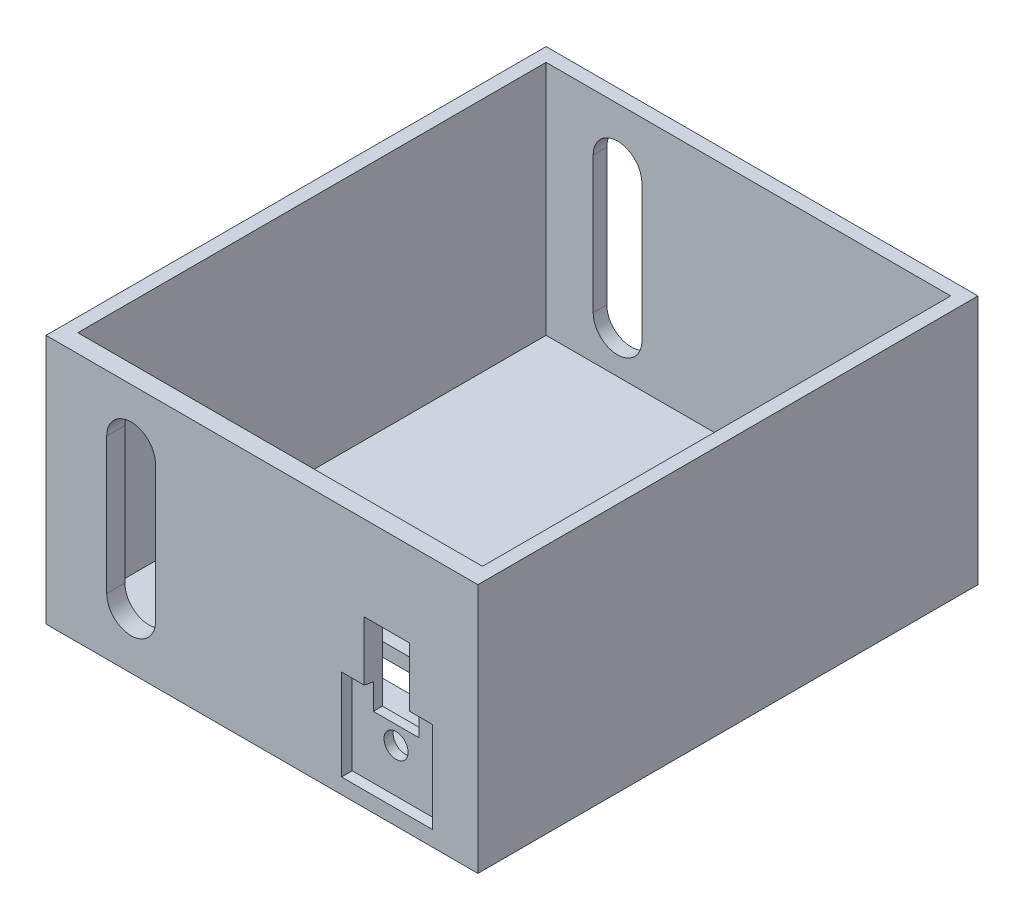
ISO-10303-21;
HEADER;
FILE_DESCRIPTION(('STEP AP214'),'2;1');
FILE_NAME('part.step','',(''),(''),'','','');
FILE_SCHEMA(('AUTOMOTIVE_DESIGN { 1 0 10303 214 1 1 1 1 }'));
ENDSEC;
DATA;
#1=APPLICATION_CONTEXT('core data for automotive mechanical design processes');
#2=APPLICATION_PROTOCOL_DEFINITION('international standard','automotive_design',2000,#1);
#3=PRODUCT_CONTEXT('',#1,'mechanical');
#4=PRODUCT('Part','Part','',(#3));
#5=PRODUCT_RELATED_PRODUCT_CATEGORY('part','',(#4));
#6=PRODUCT_DEFINITION_FORMATION('','',#4);
#7=PRODUCT_DEFINITION_CONTEXT('part definition',#1,'design');
#8=PRODUCT_DEFINITION('design','',#6,#7);
#9=PRODUCT_DEFINITION_SHAPE('','',#8);
#10=(LENGTH_UNIT() NAMED_UNIT(*) SI_UNIT(.MILLI.,.METRE.));
#11=(NAMED_UNIT(*) PLANE_ANGLE_UNIT() SI_UNIT($,.RADIAN.));
#12=(NAMED_UNIT(*) SI_UNIT($,.STERADIAN.) SOLID_ANGLE_UNIT());
#13=UNCERTAINTY_MEASURE_WITH_UNIT(LENGTH_MEASURE(1.E-05),#10,'distance_accuracy_value','');
#14=(GEOMETRIC_REPRESENTATION_CONTEXT(3) GLOBAL_UNCERTAINTY_ASSIGNED_CONTEXT((#13)) GLOBAL_UNIT_ASSIGNED_CONTEXT((#10,
#11,#12)) REPRESENTATION_CONTEXT('',''));
#15=CARTESIAN_POINT('',(0.,0.,0.));
#16=DIRECTION('',(0.,0.,1.));
#17=DIRECTION('',(1.,0.,0.));
#18=AXIS2_PLACEMENT_3D('',#15,#16,#17);
#19=CARTESIAN_POINT('',(0.,0.,0.));
#20=DIRECTION('',(0.,0.,1.));
#21=DIRECTION('',(1.,0.,0.));
#22=AXIS2_PLACEMENT_3D('',#19,#20,#21);
#23=PLANE('',#22);
#24=CARTESIAN_POINT('',(-19.0560846717894,11.6649831649832,0.));
#25=DIRECTION('',(0.,0.,1.));
#26=DIRECTION('',(1.,0.,0.));
#27=AXIS2_PLACEMENT_3D('',#24,#25,#26);
#28=CIRCLE('',#27,5.35903186294379);
#29=CARTESIAN_POINT('',(-13.6970528088456,11.6649831649832,0.));
#30=VERTEX_POINT('',#29);
#31=CARTESIAN_POINT('',(-24.4151165347332,11.6649831649832,0.));
#32=VERTEX_POINT('',#31);
#33=EDGE_CURVE('E288',#30,#32,#28,.T.);
#34=ORIENTED_EDGE('',*,*,#33,.F.);
#35=DIRECTION('',(0.,1.,0.));
#36=VECTOR('',#35,1.);
#37=CARTESIAN_POINT('',(-13.6970528088456,0.,0.));
#38=LINE('',#37,#36);
#39=CARTESIAN_POINT('',(-13.6970528088456,-18.3350168350168,0.));
#40=VERTEX_POINT('',#39);
#41=EDGE_CURVE('E273',#40,#30,#38,.T.);
#42=ORIENTED_EDGE('',*,*,#41,.F.);
#43=CARTESIAN_POINT('',(-19.0560846717894,-18.3350168350168,0.));
#44=DIRECTION('',(0.,0.,1.));
#45=DIRECTION('',(1.,0.,0.));
#46=AXIS2_PLACEMENT_3D('',#43,#44,#45);
#47=CIRCLE('',#46,5.35903186294379);
#48=CARTESIAN_POINT('',(-24.4151165347332,-18.3350168350168,0.));
#49=VERTEX_POINT('',#48);
#50=EDGE_CURVE('E278',#49,#40,#47,.T.);
#51=ORIENTED_EDGE('',*,*,#50,.F.);
#52=DIRECTION('',(0.,-1.,0.));
#53=VECTOR('',#52,1.);
#54=CARTESIAN_POINT('',(-24.4151165347332,0.,0.));
#55=LINE('',#54,#53);
#56=EDGE_CURVE('E283',#32,#49,#55,.T.);
#57=ORIENTED_EDGE('',*,*,#56,.F.);
#58=EDGE_LOOP('',(#34,#42,#51,#57));
#59=FACE_BOUND('',#58,.T.);
#60=DIRECTION('',(0.,-1.,0.));
#61=VECTOR('',#60,1.);
#62=CARTESIAN_POINT('',(-37.7684647926427,24.1649831649832,0.));
#63=LINE('',#62,#61);
#64=CARTESIAN_POINT('',(-37.7684647926427,24.1649831649832,0.));
#65=VERTEX_POINT('',#64);
#66=CARTESIAN_POINT('',(-37.7684647926426,-30.8350168350168,0.));
#67=VERTEX_POINT('',#66);
#68=EDGE_CURVE('E403',#65,#67,#63,.T.);
#69=ORIENTED_EDGE('',*,*,#68,.T.);
#70=DIRECTION('',(1.,0.,0.));
#71=VECTOR('',#70,1.);
#72=CARTESIAN_POINT('',(-37.7684647926426,-30.8350168350168,0.));
#73=LINE('',#72,#71);
#74=CARTESIAN_POINT('',(57.2315352073574,-30.8350168350168,0.));
#75=VERTEX_POINT('',#74);
#76=EDGE_CURVE('E424',#67,#75,#73,.T.);
#77=ORIENTED_EDGE('',*,*,#76,.T.);
#78=DIRECTION('',(0.,-1.,0.));
#79=VECTOR('',#78,1.);
#80=CARTESIAN_POINT('',(57.2315352073574,24.1649831649832,0.));
#81=LINE('',#80,#79);
#82=CARTESIAN_POINT('',(57.2315352073574,24.1649831649832,0.));
#83=VERTEX_POINT('',#82);
#84=EDGE_CURVE('E427',#83,#75,#81,.T.);
#85=ORIENTED_EDGE('',*,*,#84,.F.);
#86=DIRECTION('',(1.,0.,0.));
#87=VECTOR('',#86,1.);
#88=CARTESIAN_POINT('',(-37.7684647926427,24.1649831649832,0.));
#89=LINE('',#88,#87);
#90=EDGE_CURVE('E414',#65,#83,#89,.T.);
#91=ORIENTED_EDGE('',*,*,#90,.F.);
#92=EDGE_LOOP('',(#69,#77,#85,#91));
#93=FACE_BOUND('',#92,.T.);
#94=DIRECTION('',(0.,-1.,0.));
#95=VECTOR('',#94,1.);
#96=CARTESIAN_POINT('',(27.2315352073574,-7.46801346801347,0.));
#97=LINE('',#96,#95);
#98=CARTESIAN_POINT('',(27.2315352073574,-7.46801346801347,0.));
#99=VERTEX_POINT('',#98);
#100=CARTESIAN_POINT('',(27.2315352073574,-27.4680134680135,0.));
#101=VERTEX_POINT('',#100);
#102=EDGE_CURVE('E324',#99,#101,#97,.T.);
#103=ORIENTED_EDGE('',*,*,#102,.F.);
#104=DIRECTION('',(1.,0.,0.));
#105=VECTOR('',#104,1.);
#106=CARTESIAN_POINT('',(27.2315352073574,-7.46801346801347,0.));
#107=LINE('',#106,#105);
#108=CARTESIAN_POINT('',(32.2315352073574,-7.46801346801347,0.));
#109=VERTEX_POINT('',#108);
#110=EDGE_CURVE('E314',#99,#109,#107,.T.);
#111=ORIENTED_EDGE('',*,*,#110,.T.);
#112=DIRECTION('',(0.,-1.,0.));
#113=VECTOR('',#112,1.);
#114=CARTESIAN_POINT('',(32.2315352073574,5.53198653198652,0.));
#115=LINE('',#114,#113);
#116=CARTESIAN_POINT('',(32.2315352073574,5.53198653198652,0.));
#117=VERTEX_POINT('',#116);
#118=EDGE_CURVE('E360',#117,#109,#115,.T.);
#119=ORIENTED_EDGE('',*,*,#118,.F.);
#120=DIRECTION('',(1.,0.,0.));
#121=VECTOR('',#120,1.);
#122=CARTESIAN_POINT('',(32.2315352073574,5.53198653198652,0.));
#123=LINE('',#122,#121);
#124=CARTESIAN_POINT('',(42.2315352073574,5.53198653198652,0.));
#125=VERTEX_POINT('',#124);
#126=EDGE_CURVE('E366',#117,#125,#123,.T.);
#127=ORIENTED_EDGE('',*,*,#126,.T.);
#128=DIRECTION('',(0.,-1.,0.));
#129=VECTOR('',#128,1.);
#130=CARTESIAN_POINT('',(42.2315352073574,5.53198653198652,0.));
#131=LINE('',#130,#129);
#132=CARTESIAN_POINT('',(42.2315352073574,-7.46801346801347,0.));
#133=VERTEX_POINT('',#132);
#134=EDGE_CURVE('E363',#125,#133,#131,.T.);
#135=ORIENTED_EDGE('',*,*,#134,.T.);
#136=CARTESIAN_POINT('',(47.2315352073574,-7.46801346801347,0.));
#137=VERTEX_POINT('',#136);
#138=EDGE_CURVE('E318',#133,#137,#107,.T.);
#139=ORIENTED_EDGE('',*,*,#138,.T.);
#140=DIRECTION('',(0.,-1.,0.));
#141=VECTOR('',#140,1.);
#142=CARTESIAN_POINT('',(47.2315352073574,-7.46801346801347,0.));
#143=LINE('',#142,#141);
#144=CARTESIAN_POINT('',(47.2315352073574,-27.4680134680135,0.));
#145=VERTEX_POINT('',#144);
#146=EDGE_CURVE('E317',#137,#145,#143,.T.);
#147=ORIENTED_EDGE('',*,*,#146,.T.);
#148=DIRECTION('',(1.,0.,0.));
#149=VECTOR('',#148,1.);
#150=CARTESIAN_POINT('',(27.2315352073574,-27.4680134680135,0.));
#151=LINE('',#150,#149);
#152=EDGE_CURVE('E321',#101,#145,#151,.T.);
#153=ORIENTED_EDGE('',*,*,#152,.F.);
#154=EDGE_LOOP('',(#103,#111,#119,#127,#135,#139,#147,#153));
#155=FACE_BOUND('',#154,.T.);
#156=ADVANCED_FACE('F39',(#59,#93,#155),#23,.T.);
#157=CARTESIAN_POINT('',(32.2315352073574,5.53198653198652,-10.));
#158=DIRECTION('',(-1.,0.,0.));
#159=DIRECTION('',(0.,0.,1.));
#160=AXIS2_PLACEMENT_3D('',#157,#158,#159);
#161=PLANE('',#160);
#162=DIRECTION('',(0.,-0.173648177666931,-0.984807753012208));
#163=VECTOR('',#162,1.);
#164=CARTESIAN_POINT('',(32.2315352073574,-8.78611621975022,-7.47533217231269));
#165=LINE('',#164,#163);
#166=CARTESIAN_POINT('',(32.2315352073574,-7.8206674294304,-2.));
#167=VERTEX_POINT('',#166);
#168=EDGE_CURVE('E357',#167,#109,#165,.F.);
#169=ORIENTED_EDGE('',*,*,#168,.F.);
#170=DIRECTION('',(0.,-1.,0.));
#171=VECTOR('',#170,1.);
#172=CARTESIAN_POINT('',(32.2315352073574,5.53198653198652,-2.));
#173=LINE('',#172,#171);
#174=CARTESIAN_POINT('',(32.2315352073574,-13.4680134680135,-2.));
#175=VERTEX_POINT('',#174);
#176=EDGE_CURVE('E354',#167,#175,#173,.T.);
#177=ORIENTED_EDGE('',*,*,#176,.T.);
#178=DIRECTION('',(0.,0.,1.));
#179=VECTOR('',#178,1.);
#180=CARTESIAN_POINT('',(32.2315352073574,-13.4680134680135,-10.));
#181=LINE('',#180,#179);
#182=CARTESIAN_POINT('',(32.2315352073574,-13.4680134680135,-4.));
#183=VERTEX_POINT('',#182);
#184=EDGE_CURVE('E369',#183,#175,#181,.T.);
#185=ORIENTED_EDGE('',*,*,#184,.F.);
#186=DIRECTION('',(0.,-1.,0.));
#187=VECTOR('',#186,1.);
#188=CARTESIAN_POINT('',(32.2315352073574,-27.8350168350168,-4.));
#189=LINE('',#188,#187);
#190=CARTESIAN_POINT('',(32.2315352073574,5.53198653198652,-4.));
#191=VERTEX_POINT('',#190);
#192=EDGE_CURVE('E447',#191,#183,#189,.T.);
#193=ORIENTED_EDGE('',*,*,#192,.F.);
#194=DIRECTION('',(0.,0.,1.));
#195=VECTOR('',#194,1.);
#196=CARTESIAN_POINT('',(32.2315352073574,5.53198653198652,-10.));
#197=LINE('',#196,#195);
#198=EDGE_CURVE('E370',#191,#117,#197,.T.);
#199=ORIENTED_EDGE('',*,*,#198,.T.);
#200=ORIENTED_EDGE('',*,*,#118,.T.);
#201=EDGE_LOOP('',(#169,#177,#185,#193,#199,#200));
#202=FACE_BOUND('',#201,.T.);
#203=ADVANCED_FACE('F495',(#202),#161,.F.);
#204=CARTESIAN_POINT('',(42.2315352073574,5.53198653198652,-10.));
#205=DIRECTION('',(-1.,0.,0.));
#206=DIRECTION('',(0.,0.,1.));
#207=AXIS2_PLACEMENT_3D('',#204,#205,#206);
#208=PLANE('',#207);
#209=DIRECTION('',(0.,-1.,0.));
#210=VECTOR('',#209,1.);
#211=CARTESIAN_POINT('',(42.2315352073574,5.53198653198652,-2.));
#212=LINE('',#211,#210);
#213=CARTESIAN_POINT('',(42.2315352073574,-7.8206674294304,-2.));
#214=VERTEX_POINT('',#213);
#215=CARTESIAN_POINT('',(42.2315352073574,-13.4680134680135,-2.));
#216=VERTEX_POINT('',#215);
#217=EDGE_CURVE('E352',#214,#216,#212,.T.);
#218=ORIENTED_EDGE('',*,*,#217,.F.);
#219=DIRECTION('',(0.,-0.173648177666931,-0.984807753012208));
#220=VECTOR('',#219,1.);
#221=CARTESIAN_POINT('',(42.2315352073574,-8.78611621975022,-7.47533217231269));
#222=LINE('',#221,#220);
#223=EDGE_CURVE('E450',#214,#133,#222,.F.);
#224=ORIENTED_EDGE('',*,*,#223,.T.);
#225=ORIENTED_EDGE('',*,*,#134,.F.);
#226=DIRECTION('',(0.,0.,1.));
#227=VECTOR('',#226,1.);
#228=CARTESIAN_POINT('',(42.2315352073574,5.53198653198652,-10.));
#229=LINE('',#228,#227);
#230=CARTESIAN_POINT('',(42.2315352073574,5.53198653198652,-4.));
#231=VERTEX_POINT('',#230);
#232=EDGE_CURVE('E373',#231,#125,#229,.T.);
#233=ORIENTED_EDGE('',*,*,#232,.F.);
#234=DIRECTION('',(0.,-1.,0.));
#235=VECTOR('',#234,1.);
#236=CARTESIAN_POINT('',(42.2315352073574,-27.8350168350168,-4.));
#237=LINE('',#236,#235);
#238=CARTESIAN_POINT('',(42.2315352073574,-13.4680134680135,-4.));
#239=VERTEX_POINT('',#238);
#240=EDGE_CURVE('E442',#231,#239,#237,.T.);
#241=ORIENTED_EDGE('',*,*,#240,.T.);
#242=DIRECTION('',(0.,0.,1.));
#243=VECTOR('',#242,1.);
#244=CARTESIAN_POINT('',(42.2315352073574,-13.4680134680135,-10.));
#245=LINE('',#244,#243);
#246=EDGE_CURVE('E375',#239,#216,#245,.T.);
#247=ORIENTED_EDGE('',*,*,#246,.T.);
#248=EDGE_LOOP('',(#218,#224,#225,#233,#241,#247));
#249=FACE_BOUND('',#248,.T.);
#250=ADVANCED_FACE('F501',(#249),#208,.T.);
#251=CARTESIAN_POINT('',(-37.7684647926427,24.1649831649832,-110.));
#252=DIRECTION('',(-1.,0.,0.));
#253=DIRECTION('',(0.,-1.,0.));
#254=AXIS2_PLACEMENT_3D('',#251,#252,#253);
#255=PLANE('',#254);
#256=ORIENTED_EDGE('',*,*,#68,.F.);
#257=DIRECTION('',(0.,0.,1.));
#258=VECTOR('',#257,1.);
#259=CARTESIAN_POINT('',(-37.7684647926427,24.1649831649832,-110.));
#260=LINE('',#259,#258);
#261=CARTESIAN_POINT('',(-37.7684647926427,24.1649831649832,-110.));
#262=VERTEX_POINT('',#261);
#263=EDGE_CURVE('E431',#262,#65,#260,.T.);
#264=ORIENTED_EDGE('',*,*,#263,.F.);
#265=DIRECTION('',(0.,-1.,0.));
#266=VECTOR('',#265,1.);
#267=CARTESIAN_POINT('',(-37.7684647926427,24.1649831649832,-110.));
#268=LINE('',#267,#266);
#269=CARTESIAN_POINT('',(-37.7684647926426,-30.8350168350168,-110.));
#270=VERTEX_POINT('',#269);
#271=EDGE_CURVE('E410',#262,#270,#268,.T.);
#272=ORIENTED_EDGE('',*,*,#271,.T.);
#273=DIRECTION('',(0.,0.,1.));
#274=VECTOR('',#273,1.);
#275=CARTESIAN_POINT('',(-37.7684647926426,-30.8350168350168,-110.));
#276=LINE('',#275,#274);
#277=EDGE_CURVE('E421',#270,#67,#276,.T.);
#278=ORIENTED_EDGE('',*,*,#277,.T.);
#279=EDGE_LOOP('',(#256,#264,#272,#278));
#280=FACE_BOUND('',#279,.T.);
#281=ADVANCED_FACE('F41',(#280),#255,.T.);
#282=CARTESIAN_POINT('',(-37.7684647926427,24.1649831649832,-110.));
#283=DIRECTION('',(0.,-1.,0.));
#284=DIRECTION('',(0.,0.,-1.));
#285=AXIS2_PLACEMENT_3D('',#282,#283,#284);
#286=PLANE('',#285);
#287=DIRECTION('',(0.,0.,1.));
#288=VECTOR('',#287,1.);
#289=CARTESIAN_POINT('',(54.2315352073574,24.1649831649832,-107.));
#290=LINE('',#289,#288);
#291=CARTESIAN_POINT('',(54.2315352073574,24.1649831649832,-107.));
#292=VERTEX_POINT('',#291);
#293=CARTESIAN_POINT('',(54.2315352073574,24.1649831649832,-4.));
#294=VERTEX_POINT('',#293);
#295=EDGE_CURVE('E393',#292,#294,#290,.T.);
#296=ORIENTED_EDGE('',*,*,#295,.T.);
#297=DIRECTION('',(1.,0.,0.));
#298=VECTOR('',#297,1.);
#299=CARTESIAN_POINT('',(-34.7684647926426,24.1649831649832,-4.));
#300=LINE('',#299,#298);
#301=CARTESIAN_POINT('',(-34.7684647926426,24.1649831649832,-4.));
#302=VERTEX_POINT('',#301);
#303=EDGE_CURVE('E372',#302,#294,#300,.T.);
#304=ORIENTED_EDGE('',*,*,#303,.F.);
#305=DIRECTION('',(0.,0.,1.));
#306=VECTOR('',#305,1.);
#307=CARTESIAN_POINT('',(-34.7684647926427,24.1649831649832,-107.));
#308=LINE('',#307,#306);
#309=CARTESIAN_POINT('',(-34.7684647926427,24.1649831649832,-107.));
#310=VERTEX_POINT('',#309);
#311=EDGE_CURVE('E384',#310,#302,#308,.T.);
#312=ORIENTED_EDGE('',*,*,#311,.F.);
#313=DIRECTION('',(1.,0.,0.));
#314=VECTOR('',#313,1.);
#315=CARTESIAN_POINT('',(-34.7684647926427,24.1649831649832,-107.));
#316=LINE('',#315,#314);
#317=EDGE_CURVE('E396',#310,#292,#316,.T.);
#318=ORIENTED_EDGE('',*,*,#317,.T.);
#319=EDGE_LOOP('',(#296,#304,#312,#318));
#320=FACE_BOUND('',#319,.T.);
#321=ORIENTED_EDGE('',*,*,#90,.T.);
#322=DIRECTION('',(0.,0.,1.));
#323=VECTOR('',#322,1.);
#324=CARTESIAN_POINT('',(57.2315352073574,24.1649831649832,-110.));
#325=LINE('',#324,#323);
#326=CARTESIAN_POINT('',(57.2315352073574,24.1649831649832,-110.));
#327=VERTEX_POINT('',#326);
#328=EDGE_CURVE('E434',#327,#83,#325,.T.);
#329=ORIENTED_EDGE('',*,*,#328,.F.);
#330=DIRECTION('',(1.,0.,0.));
#331=VECTOR('',#330,1.);
#332=CARTESIAN_POINT('',(-37.7684647926427,24.1649831649832,-110.));
#333=LINE('',#332,#331);
#334=EDGE_CURVE('E419',#262,#327,#333,.T.);
#335=ORIENTED_EDGE('',*,*,#334,.F.);
#336=ORIENTED_EDGE('',*,*,#263,.T.);
#337=EDGE_LOOP('',(#321,#329,#335,#336));
#338=FACE_BOUND('',#337,.T.);
#339=ADVANCED_FACE('F509',(#320,#338),#286,.F.);
#340=CARTESIAN_POINT('',(57.2315352073574,24.1649831649832,-110.));
#341=DIRECTION('',(-1.,0.,0.));
#342=DIRECTION('',(0.,-1.,0.));
#343=AXIS2_PLACEMENT_3D('',#340,#341,#342);
#344=PLANE('',#343);
#345=ORIENTED_EDGE('',*,*,#84,.T.);
#346=DIRECTION('',(0.,0.,1.));
#347=VECTOR('',#346,1.);
#348=CARTESIAN_POINT('',(57.2315352073574,-30.8350168350168,-110.));
#349=LINE('',#348,#347);
#350=CARTESIAN_POINT('',(57.2315352073574,-30.8350168350168,-110.));
#351=VERTEX_POINT('',#350);
#352=EDGE_CURVE('E437',#351,#75,#349,.T.);
#353=ORIENTED_EDGE('',*,*,#352,.F.);
#354=DIRECTION('',(0.,-1.,0.));
#355=VECTOR('',#354,1.);
#356=CARTESIAN_POINT('',(57.2315352073574,24.1649831649832,-110.));
#357=LINE('',#356,#355);
#358=EDGE_CURVE('E417',#327,#351,#357,.T.);
#359=ORIENTED_EDGE('',*,*,#358,.F.);
#360=ORIENTED_EDGE('',*,*,#328,.T.);
#361=EDGE_LOOP('',(#345,#353,#359,#360));
#362=FACE_BOUND('',#361,.T.);
#363=ADVANCED_FACE('F512',(#362),#344,.F.);
#364=CARTESIAN_POINT('',(-37.7684647926426,-30.8350168350168,-110.));
#365=DIRECTION('',(0.,-1.,0.));
#366=DIRECTION('',(0.,0.,-1.));
#367=AXIS2_PLACEMENT_3D('',#364,#365,#366);
#368=PLANE('',#367);
#369=CARTESIAN_POINT('',(9.73153520735737,-30.8350168350168,-55.));
#370=DIRECTION('',(0.,-1.,0.));
#371=DIRECTION('',(0.,0.,-1.));
#372=AXIS2_PLACEMENT_3D('',#369,#370,#371);
#373=CIRCLE('',#372,2.65);
#374=CARTESIAN_POINT('',(9.73153520735737,-30.8350168350168,-57.65));
#375=VERTEX_POINT('',#374);
#376=EDGE_CURVE('E291',#375,#375,#373,.T.);
#377=ORIENTED_EDGE('',*,*,#376,.F.);
#378=EDGE_LOOP('',(#377));
#379=FACE_BOUND('',#378,.T.);
#380=CARTESIAN_POINT('',(-12.7119898352291,-30.8350168350168,-27.2029735711083));
#381=DIRECTION('',(0.,-1.,0.));
#382=DIRECTION('',(0.,0.,-1.));
#383=AXIS2_PLACEMENT_3D('',#380,#381,#382);
#384=CIRCLE('',#383,3.5003662910456);
#385=CARTESIAN_POINT('',(-12.7119898352291,-30.8350168350168,-23.7026072800627));
#386=VERTEX_POINT('',#385);
#387=CARTESIAN_POINT('',(-12.7119898352291,-30.8350168350168,-30.7033398621539));
#388=VERTEX_POINT('',#387);
#389=EDGE_CURVE('E295',#386,#388,#384,.T.);
#390=ORIENTED_EDGE('',*,*,#389,.F.);
#391=DIRECTION('',(-1.,0.,0.));
#392=VECTOR('',#391,1.);
#393=CARTESIAN_POINT('',(-12.7119898352291,-30.8350168350168,-23.7026072800627));
#394=LINE('',#393,#392);
#395=CARTESIAN_POINT('',(32.1750602499439,-30.8350168350168,-23.7026072800627));
#396=VERTEX_POINT('',#395);
#397=EDGE_CURVE('E299',#396,#386,#394,.T.);
#398=ORIENTED_EDGE('',*,*,#397,.F.);
#399=CARTESIAN_POINT('',(32.1750602499439,-30.8350168350168,-27.2029735711083));
#400=DIRECTION('',(0.,-1.,0.));
#401=DIRECTION('',(0.,0.,-1.));
#402=AXIS2_PLACEMENT_3D('',#399,#400,#401);
#403=CIRCLE('',#402,3.5003662910456);
#404=CARTESIAN_POINT('',(32.1750602499439,-30.8350168350168,-30.7033398621539));
#405=VERTEX_POINT('',#404);
#406=EDGE_CURVE('E307',#405,#396,#403,.T.);
#407=ORIENTED_EDGE('',*,*,#406,.F.);
#408=DIRECTION('',(1.,0.,0.));
#409=VECTOR('',#408,1.);
#410=CARTESIAN_POINT('',(-12.7119898352291,-30.8350168350168,-30.7033398621539));
#411=LINE('',#410,#409);
#412=EDGE_CURVE('E310',#388,#405,#411,.T.);
#413=ORIENTED_EDGE('',*,*,#412,.F.);
#414=EDGE_LOOP('',(#390,#398,#407,#413));
#415=FACE_BOUND('',#414,.T.);
#416=ORIENTED_EDGE('',*,*,#76,.F.);
#417=ORIENTED_EDGE('',*,*,#277,.F.);
#418=DIRECTION('',(1.,0.,0.));
#419=VECTOR('',#418,1.);
#420=CARTESIAN_POINT('',(-37.7684647926426,-30.8350168350168,-110.));
#421=LINE('',#420,#419);
#422=EDGE_CURVE('E413',#270,#351,#421,.T.);
#423=ORIENTED_EDGE('',*,*,#422,.T.);
#424=ORIENTED_EDGE('',*,*,#352,.T.);
#425=EDGE_LOOP('',(#416,#417,#423,#424));
#426=FACE_BOUND('',#425,.T.);
#427=ADVANCED_FACE('F515',(#379,#415,#426),#368,.T.);
#428=CARTESIAN_POINT('',(0.,0.,-110.));
#429=DIRECTION('',(0.,0.,1.));
#430=DIRECTION('',(1.,0.,0.));
#431=AXIS2_PLACEMENT_3D('',#428,#429,#430);
#432=PLANE('',#431);
#433=DIRECTION('',(0.,-1.,0.));
#434=VECTOR('',#433,1.);
#435=CARTESIAN_POINT('',(-13.6970528088456,11.6649831649832,-110.));
#436=LINE('',#435,#434);
#437=CARTESIAN_POINT('',(-13.6970528088456,11.6649831649832,-110.));
#438=VERTEX_POINT('',#437);
#439=CARTESIAN_POINT('',(-13.6970528088456,-18.3350168350168,-110.));
#440=VERTEX_POINT('',#439);
#441=EDGE_CURVE('E250',#438,#440,#436,.T.);
#442=ORIENTED_EDGE('',*,*,#441,.F.);
#443=CARTESIAN_POINT('',(-19.0560846717894,11.6649831649832,-110.));
#444=DIRECTION('',(0.,0.,-1.));
#445=DIRECTION('',(-1.,0.,0.));
#446=AXIS2_PLACEMENT_3D('',#443,#444,#445);
#447=CIRCLE('',#446,5.35903186294379);
#448=CARTESIAN_POINT('',(-24.4151165347332,11.6649831649832,-110.));
#449=VERTEX_POINT('',#448);
#450=EDGE_CURVE('E62',#449,#438,#447,.T.);
#451=ORIENTED_EDGE('',*,*,#450,.F.);
#452=DIRECTION('',(0.,1.,0.));
#453=VECTOR('',#452,1.);
#454=CARTESIAN_POINT('',(-24.4151165347332,11.6649831649832,-110.));
#455=LINE('',#454,#453);
#456=CARTESIAN_POINT('',(-24.4151165347332,-18.3350168350168,-110.));
#457=VERTEX_POINT('',#456);
#458=EDGE_CURVE('E258',#457,#449,#455,.T.);
#459=ORIENTED_EDGE('',*,*,#458,.F.);
#460=CARTESIAN_POINT('',(-19.0560846717894,-18.3350168350168,-110.));
#461=DIRECTION('',(0.,0.,-1.));
#462=DIRECTION('',(-1.,0.,0.));
#463=AXIS2_PLACEMENT_3D('',#460,#461,#462);
#464=CIRCLE('',#463,5.35903186294379);
#465=EDGE_CURVE('E241',#440,#457,#464,.T.);
#466=ORIENTED_EDGE('',*,*,#465,.F.);
#467=EDGE_LOOP('',(#442,#451,#459,#466));
#468=FACE_BOUND('',#467,.T.);
#469=ORIENTED_EDGE('',*,*,#271,.F.);
#470=ORIENTED_EDGE('',*,*,#334,.T.);
#471=ORIENTED_EDGE('',*,*,#358,.T.);
#472=ORIENTED_EDGE('',*,*,#422,.F.);
#473=EDGE_LOOP('',(#469,#470,#471,#472));
#474=FACE_BOUND('',#473,.T.);
#475=ADVANCED_FACE('F255',(#468,#474),#432,.F.);
#476=CARTESIAN_POINT('',(-34.7684647926426,-27.8350168350168,-4.));
#477=DIRECTION('',(0.,0.,1.));
#478=DIRECTION('',(1.,0.,0.));
#479=AXIS2_PLACEMENT_3D('',#476,#477,#478);
#480=PLANE('',#479);
#481=DIRECTION('',(0.,1.,0.));
#482=VECTOR('',#481,1.);
#483=CARTESIAN_POINT('',(-13.6970528088456,-27.8350168350168,-4.));
#484=LINE('',#483,#482);
#485=CARTESIAN_POINT('',(-13.6970528088456,-18.3350168350168,-4.));
#486=VERTEX_POINT('',#485);
#487=CARTESIAN_POINT('',(-13.6970528088456,11.6649831649832,-4.));
#488=VERTEX_POINT('',#487);
#489=EDGE_CURVE('E270',#486,#488,#484,.T.);
#490=ORIENTED_EDGE('',*,*,#489,.T.);
#491=CARTESIAN_POINT('',(-19.0560846717894,11.6649831649832,-4.));
#492=DIRECTION('',(0.,0.,1.));
#493=DIRECTION('',(1.,0.,0.));
#494=AXIS2_PLACEMENT_3D('',#491,#492,#493);
#495=CIRCLE('',#494,5.35903186294379);
#496=CARTESIAN_POINT('',(-24.4151165347332,11.6649831649832,-4.));
#497=VERTEX_POINT('',#496);
#498=EDGE_CURVE('E285',#488,#497,#495,.T.);
#499=ORIENTED_EDGE('',*,*,#498,.T.);
#500=DIRECTION('',(0.,-1.,0.));
#501=VECTOR('',#500,1.);
#502=CARTESIAN_POINT('',(-24.4151165347332,-27.8350168350168,-4.));
#503=LINE('',#502,#501);
#504=CARTESIAN_POINT('',(-24.4151165347332,-18.3350168350168,-4.));
#505=VERTEX_POINT('',#504);
#506=EDGE_CURVE('E280',#497,#505,#503,.T.);
#507=ORIENTED_EDGE('',*,*,#506,.T.);
#508=CARTESIAN_POINT('',(-19.0560846717894,-18.3350168350168,-4.));
#509=DIRECTION('',(0.,0.,1.));
#510=DIRECTION('',(1.,0.,0.));
#511=AXIS2_PLACEMENT_3D('',#508,#509,#510);
#512=CIRCLE('',#511,5.35903186294379);
#513=EDGE_CURVE('E275',#505,#486,#512,.T.);
#514=ORIENTED_EDGE('',*,*,#513,.T.);
#515=EDGE_LOOP('',(#490,#499,#507,#514));
#516=FACE_BOUND('',#515,.T.);
#517=CARTESIAN_POINT('',(37.2315352073574,-17.4680134680135,-4.));
#518=DIRECTION('',(0.,0.,1.));
#519=DIRECTION('',(1.,0.,0.));
#520=AXIS2_PLACEMENT_3D('',#517,#518,#519);
#521=CIRCLE('',#520,2.65);
#522=CARTESIAN_POINT('',(39.8815352073574,-17.4680134680135,-4.));
#523=VERTEX_POINT('',#522);
#524=EDGE_CURVE('E359',#523,#523,#521,.T.);
#525=ORIENTED_EDGE('',*,*,#524,.T.);
#526=EDGE_LOOP('',(#525));
#527=FACE_BOUND('',#526,.T.);
#528=DIRECTION('',(1.,0.,0.));
#529=VECTOR('',#528,1.);
#530=CARTESIAN_POINT('',(-34.7684647926426,5.53198653198653,-4.));
#531=LINE('',#530,#529);
#532=EDGE_CURVE('E445',#191,#231,#531,.T.);
#533=ORIENTED_EDGE('',*,*,#532,.F.);
#534=ORIENTED_EDGE('',*,*,#192,.T.);
#535=DIRECTION('',(1.,0.,0.));
#536=VECTOR('',#535,1.);
#537=CARTESIAN_POINT('',(-34.7684647926426,-13.4680134680135,-4.));
#538=LINE('',#537,#536);
#539=EDGE_CURVE('E433',#183,#239,#538,.T.);
#540=ORIENTED_EDGE('',*,*,#539,.T.);
#541=ORIENTED_EDGE('',*,*,#240,.F.);
#542=EDGE_LOOP('',(#533,#534,#540,#541));
#543=FACE_BOUND('',#542,.T.);
#544=ORIENTED_EDGE('',*,*,#303,.T.);
#545=DIRECTION('',(0.,1.,0.));
#546=VECTOR('',#545,1.);
#547=CARTESIAN_POINT('',(54.2315352073574,-27.8350168350168,-4.));
#548=LINE('',#547,#546);
#549=CARTESIAN_POINT('',(54.2315352073574,-27.8350168350168,-4.));
#550=VERTEX_POINT('',#549);
#551=EDGE_CURVE('E391',#550,#294,#548,.T.);
#552=ORIENTED_EDGE('',*,*,#551,.F.);
#553=DIRECTION('',(1.,0.,0.));
#554=VECTOR('',#553,1.);
#555=CARTESIAN_POINT('',(-34.7684647926426,-27.8350168350168,-4.));
#556=LINE('',#555,#554);
#557=CARTESIAN_POINT('',(-34.7684647926426,-27.8350168350168,-4.));
#558=VERTEX_POINT('',#557);
#559=EDGE_CURVE('E380',#558,#550,#556,.T.);
#560=ORIENTED_EDGE('',*,*,#559,.F.);
#561=DIRECTION('',(0.,1.,0.));
#562=VECTOR('',#561,1.);
#563=CARTESIAN_POINT('',(-34.7684647926426,-27.8350168350168,-4.));
#564=LINE('',#563,#562);
#565=EDGE_CURVE('E401',#558,#302,#564,.T.);
#566=ORIENTED_EDGE('',*,*,#565,.T.);
#567=EDGE_LOOP('',(#544,#552,#560,#566));
#568=FACE_BOUND('',#567,.T.);
#569=ADVANCED_FACE('F522',(#516,#527,#543,#568),#480,.F.);
#570=CARTESIAN_POINT('',(-34.7684647926427,-27.8350168350168,-107.));
#571=DIRECTION('',(-1.,0.,0.));
#572=DIRECTION('',(0.,0.,1.));
#573=AXIS2_PLACEMENT_3D('',#570,#571,#572);
#574=PLANE('',#573);
#575=ORIENTED_EDGE('',*,*,#311,.T.);
#576=ORIENTED_EDGE('',*,*,#565,.F.);
#577=DIRECTION('',(0.,0.,1.));
#578=VECTOR('',#577,1.);
#579=CARTESIAN_POINT('',(-34.7684647926427,-27.8350168350168,-107.));
#580=LINE('',#579,#578);
#581=CARTESIAN_POINT('',(-34.7684647926427,-27.8350168350168,-107.));
#582=VERTEX_POINT('',#581);
#583=EDGE_CURVE('E388',#582,#558,#580,.T.);
#584=ORIENTED_EDGE('',*,*,#583,.F.);
#585=DIRECTION('',(0.,1.,0.));
#586=VECTOR('',#585,1.);
#587=CARTESIAN_POINT('',(-34.7684647926427,-27.8350168350168,-107.));
#588=LINE('',#587,#586);
#589=EDGE_CURVE('E404',#582,#310,#588,.T.);
#590=ORIENTED_EDGE('',*,*,#589,.T.);
#591=EDGE_LOOP('',(#575,#576,#584,#590));
#592=FACE_BOUND('',#591,.T.);
#593=ADVANCED_FACE('F565',(#592),#574,.F.);
#594=CARTESIAN_POINT('',(-34.7684647926427,-27.8350168350168,-107.));
#595=DIRECTION('',(0.,0.,1.));
#596=DIRECTION('',(1.,0.,0.));
#597=AXIS2_PLACEMENT_3D('',#594,#595,#596);
#598=PLANE('',#597);
#599=CARTESIAN_POINT('',(-19.0560846717894,11.6649831649832,-107.));
#600=DIRECTION('',(0.,0.,1.));
#601=DIRECTION('',(1.,0.,0.));
#602=AXIS2_PLACEMENT_3D('',#599,#600,#601);
#603=CIRCLE('',#602,5.35903186294379);
#604=CARTESIAN_POINT('',(-13.6970528088456,11.6649831649832,-107.));
#605=VERTEX_POINT('',#604);
#606=CARTESIAN_POINT('',(-24.4151165347332,11.6649831649832,-107.));
#607=VERTEX_POINT('',#606);
#608=EDGE_CURVE('E11',#605,#607,#603,.T.);
#609=ORIENTED_EDGE('',*,*,#608,.F.);
#610=DIRECTION('',(0.,1.,0.));
#611=VECTOR('',#610,1.);
#612=CARTESIAN_POINT('',(-13.6970528088456,-27.8350168350168,-107.));
#613=LINE('',#612,#611);
#614=CARTESIAN_POINT('',(-13.6970528088456,-18.3350168350168,-107.));
#615=VERTEX_POINT('',#614);
#616=EDGE_CURVE('E469',#615,#605,#613,.T.);
#617=ORIENTED_EDGE('',*,*,#616,.F.);
#618=CARTESIAN_POINT('',(-19.0560846717894,-18.3350168350168,-107.));
#619=DIRECTION('',(0.,0.,1.));
#620=DIRECTION('',(1.,0.,0.));
#621=AXIS2_PLACEMENT_3D('',#618,#619,#620);
#622=CIRCLE('',#621,5.35903186294379);
#623=CARTESIAN_POINT('',(-24.4151165347332,-18.3350168350168,-107.));
#624=VERTEX_POINT('',#623);
#625=EDGE_CURVE('E244',#624,#615,#622,.T.);
#626=ORIENTED_EDGE('',*,*,#625,.F.);
#627=DIRECTION('',(0.,-1.,0.));
#628=VECTOR('',#627,1.);
#629=CARTESIAN_POINT('',(-24.4151165347332,-27.8350168350168,-107.));
#630=LINE('',#629,#628);
#631=EDGE_CURVE('E47',#607,#624,#630,.T.);
#632=ORIENTED_EDGE('',*,*,#631,.F.);
#633=EDGE_LOOP('',(#609,#617,#626,#632));
#634=FACE_BOUND('',#633,.T.);
#635=ORIENTED_EDGE('',*,*,#317,.F.);
#636=ORIENTED_EDGE('',*,*,#589,.F.);
#637=DIRECTION('',(1.,0.,0.));
#638=VECTOR('',#637,1.);
#639=CARTESIAN_POINT('',(-34.7684647926427,-27.8350168350168,-107.));
#640=LINE('',#639,#638);
#641=CARTESIAN_POINT('',(54.2315352073574,-27.8350168350168,-107.));
#642=VERTEX_POINT('',#641);
#643=EDGE_CURVE('E386',#582,#642,#640,.T.);
#644=ORIENTED_EDGE('',*,*,#643,.T.);
#645=DIRECTION('',(0.,1.,0.));
#646=VECTOR('',#645,1.);
#647=CARTESIAN_POINT('',(54.2315352073574,-27.8350168350168,-107.));
#648=LINE('',#647,#646);
#649=EDGE_CURVE('E406',#642,#292,#648,.T.);
#650=ORIENTED_EDGE('',*,*,#649,.T.);
#651=EDGE_LOOP('',(#635,#636,#644,#650));
#652=FACE_BOUND('',#651,.T.);
#653=ADVANCED_FACE('F479',(#634,#652),#598,.T.);
#654=CARTESIAN_POINT('',(54.2315352073574,-27.8350168350168,-107.));
#655=DIRECTION('',(-1.,0.,0.));
#656=DIRECTION('',(0.,0.,1.));
#657=AXIS2_PLACEMENT_3D('',#654,#655,#656);
#658=PLANE('',#657);
#659=ORIENTED_EDGE('',*,*,#295,.F.);
#660=ORIENTED_EDGE('',*,*,#649,.F.);
#661=DIRECTION('',(0.,0.,1.));
#662=VECTOR('',#661,1.);
#663=CARTESIAN_POINT('',(54.2315352073574,-27.8350168350168,-107.));
#664=LINE('',#663,#662);
#665=EDGE_CURVE('E383',#642,#550,#664,.T.);
#666=ORIENTED_EDGE('',*,*,#665,.T.);
#667=ORIENTED_EDGE('',*,*,#551,.T.);
#668=EDGE_LOOP('',(#659,#660,#666,#667));
#669=FACE_BOUND('',#668,.T.);
#670=ADVANCED_FACE('F563',(#669),#658,.T.);
#671=CARTESIAN_POINT('',(0.,-27.8350168350168,0.));
#672=DIRECTION('',(0.,-1.,0.));
#673=DIRECTION('',(0.,0.,-1.));
#674=AXIS2_PLACEMENT_3D('',#671,#672,#673);
#675=PLANE('',#674);
#676=CARTESIAN_POINT('',(9.73153520735737,-27.8350168350168,-55.));
#677=DIRECTION('',(0.,-1.,0.));
#678=DIRECTION('',(0.,0.,-1.));
#679=AXIS2_PLACEMENT_3D('',#676,#677,#678);
#680=CIRCLE('',#679,2.65);
#681=CARTESIAN_POINT('',(9.73153520735737,-27.8350168350168,-57.65));
#682=VERTEX_POINT('',#681);
#683=EDGE_CURVE('E294',#682,#682,#680,.T.);
#684=ORIENTED_EDGE('',*,*,#683,.T.);
#685=EDGE_LOOP('',(#684));
#686=FACE_BOUND('',#685,.T.);
#687=DIRECTION('',(-1.,0.,0.));
#688=VECTOR('',#687,1.);
#689=CARTESIAN_POINT('',(0.,-27.8350168350168,-23.7026072800627));
#690=LINE('',#689,#688);
#691=CARTESIAN_POINT('',(32.1750602499439,-27.8350168350168,-23.7026072800627));
#692=VERTEX_POINT('',#691);
#693=CARTESIAN_POINT('',(-12.7119898352291,-27.8350168350168,-23.7026072800627));
#694=VERTEX_POINT('',#693);
#695=EDGE_CURVE('E463',#692,#694,#690,.T.);
#696=ORIENTED_EDGE('',*,*,#695,.T.);
#697=CARTESIAN_POINT('',(-12.7119898352291,-27.8350168350168,-27.2029735711083));
#698=DIRECTION('',(0.,-1.,0.));
#699=DIRECTION('',(0.,0.,-1.));
#700=AXIS2_PLACEMENT_3D('',#697,#698,#699);
#701=CIRCLE('',#700,3.5003662910456);
#702=CARTESIAN_POINT('',(-12.7119898352291,-27.8350168350168,-30.7033398621539));
#703=VERTEX_POINT('',#702);
#704=EDGE_CURVE('E466',#694,#703,#701,.T.);
#705=ORIENTED_EDGE('',*,*,#704,.T.);
#706=DIRECTION('',(1.,0.,0.));
#707=VECTOR('',#706,1.);
#708=CARTESIAN_POINT('',(0.,-27.8350168350168,-30.7033398621539));
#709=LINE('',#708,#707);
#710=CARTESIAN_POINT('',(32.1750602499439,-27.8350168350168,-30.7033398621539));
#711=VERTEX_POINT('',#710);
#712=EDGE_CURVE('E457',#703,#711,#709,.T.);
#713=ORIENTED_EDGE('',*,*,#712,.T.);
#714=CARTESIAN_POINT('',(32.1750602499439,-27.8350168350168,-27.2029735711083));
#715=DIRECTION('',(0.,-1.,0.));
#716=DIRECTION('',(0.,0.,-1.));
#717=AXIS2_PLACEMENT_3D('',#714,#715,#716);
#718=CIRCLE('',#717,3.5003662910456);
#719=EDGE_CURVE('E460',#711,#692,#718,.T.);
#720=ORIENTED_EDGE('',*,*,#719,.T.);
#721=EDGE_LOOP('',(#696,#705,#713,#720));
#722=FACE_BOUND('',#721,.T.);
#723=ORIENTED_EDGE('',*,*,#559,.T.);
#724=ORIENTED_EDGE('',*,*,#665,.F.);
#725=ORIENTED_EDGE('',*,*,#643,.F.);
#726=ORIENTED_EDGE('',*,*,#583,.T.);
#727=EDGE_LOOP('',(#723,#724,#725,#726));
#728=FACE_BOUND('',#727,.T.);
#729=ADVANCED_FACE('F560',(#686,#722,#728),#675,.F.);
#730=CARTESIAN_POINT('',(32.2315352073574,5.53198653198652,-10.));
#731=DIRECTION('',(0.,-1.,0.));
#732=DIRECTION('',(0.,0.,-1.));
#733=AXIS2_PLACEMENT_3D('',#730,#731,#732);
#734=PLANE('',#733);
#735=ORIENTED_EDGE('',*,*,#532,.T.);
#736=ORIENTED_EDGE('',*,*,#232,.T.);
#737=ORIENTED_EDGE('',*,*,#126,.F.);
#738=ORIENTED_EDGE('',*,*,#198,.F.);
#739=EDGE_LOOP('',(#735,#736,#737,#738));
#740=FACE_BOUND('',#739,.T.);
#741=ADVANCED_FACE('F553',(#740),#734,.T.);
#742=CARTESIAN_POINT('',(32.2315352073574,-13.4680134680135,-10.));
#743=DIRECTION('',(0.,-1.,0.));
#744=DIRECTION('',(0.,0.,-1.));
#745=AXIS2_PLACEMENT_3D('',#742,#743,#744);
#746=PLANE('',#745);
#747=ORIENTED_EDGE('',*,*,#184,.T.);
#748=DIRECTION('',(1.,0.,0.));
#749=VECTOR('',#748,1.);
#750=CARTESIAN_POINT('',(32.2315352073574,-13.4680134680135,-2.));
#751=LINE('',#750,#749);
#752=EDGE_CURVE('E349',#175,#216,#751,.T.);
#753=ORIENTED_EDGE('',*,*,#752,.T.);
#754=ORIENTED_EDGE('',*,*,#246,.F.);
#755=ORIENTED_EDGE('',*,*,#539,.F.);
#756=EDGE_LOOP('',(#747,#753,#754,#755));
#757=FACE_BOUND('',#756,.T.);
#758=ADVANCED_FACE('F555',(#757),#746,.F.);
#759=CARTESIAN_POINT('',(37.2315352073574,-17.4680134680135,-10.));
#760=DIRECTION('',(0.,0.,1.));
#761=DIRECTION('',(1.,0.,0.));
#762=AXIS2_PLACEMENT_3D('',#759,#760,#761);
#763=CYLINDRICAL_SURFACE('',#762,2.65);
#764=CARTESIAN_POINT('',(37.2315352073574,-17.4680134680135,-2.));
#765=DIRECTION('',(0.,0.,-1.));
#766=DIRECTION('',(-1.,0.,0.));
#767=AXIS2_PLACEMENT_3D('',#764,#765,#766);
#768=CIRCLE('',#767,2.65);
#769=CARTESIAN_POINT('',(34.5815352073574,-17.4680134680135,-2.));
#770=VERTEX_POINT('',#769);
#771=EDGE_CURVE('E331',#770,#770,#768,.F.);
#772=ORIENTED_EDGE('',*,*,#771,.T.);
#773=EDGE_LOOP('',(#772));
#774=FACE_BOUND('',#773,.T.);
#775=ORIENTED_EDGE('',*,*,#524,.F.);
#776=EDGE_LOOP('',(#775));
#777=FACE_BOUND('',#776,.T.);
#778=ADVANCED_FACE('F557',(#774,#777),#763,.F.);
#779=CARTESIAN_POINT('',(27.2315352073574,-7.46801346801347,0.));
#780=DIRECTION('',(0.,0.984807753012208,-0.173648177666931));
#781=DIRECTION('',(0.,0.173648177666931,0.984807753012208));
#782=AXIS2_PLACEMENT_3D('',#779,#780,#781);
#783=PLANE('',#782);
#784=ORIENTED_EDGE('',*,*,#168,.T.);
#785=ORIENTED_EDGE('',*,*,#110,.F.);
#786=DIRECTION('',(0.171087869746036,-0.171087869746036,-0.970287525247814));
#787=VECTOR('',#786,1.);
#788=CARTESIAN_POINT('',(27.2315352073574,-7.46801346801347,0.));
#789=LINE('',#788,#787);
#790=CARTESIAN_POINT('',(27.5841891687743,-7.8206674294304,-2.));
#791=VERTEX_POINT('',#790);
#792=EDGE_CURVE('E333',#791,#99,#789,.F.);
#793=ORIENTED_EDGE('',*,*,#792,.F.);
#794=DIRECTION('',(-1.,0.,0.));
#795=VECTOR('',#794,1.);
#796=CARTESIAN_POINT('',(27.2315352073574,-7.8206674294304,-2.));
#797=LINE('',#796,#795);
#798=EDGE_CURVE('E339',#791,#167,#797,.F.);
#799=ORIENTED_EDGE('',*,*,#798,.T.);
#800=EDGE_LOOP('',(#784,#785,#793,#799));
#801=FACE_BOUND('',#800,.T.);
#802=ADVANCED_FACE('F624',(#801),#783,.F.);
#803=CARTESIAN_POINT('',(0.,0.,-2.));
#804=DIRECTION('',(0.,0.,-1.));
#805=DIRECTION('',(-1.,0.,0.));
#806=AXIS2_PLACEMENT_3D('',#803,#804,#805);
#807=PLANE('',#806);
#808=ORIENTED_EDGE('',*,*,#771,.F.);
#809=EDGE_LOOP('',(#808));
#810=FACE_BOUND('',#809,.T.);
#811=ORIENTED_EDGE('',*,*,#798,.F.);
#812=DIRECTION('',(0.,-1.,0.));
#813=VECTOR('',#812,1.);
#814=CARTESIAN_POINT('',(27.5841891687743,-7.46801346801347,-2.));
#815=LINE('',#814,#813);
#816=CARTESIAN_POINT('',(27.5841891687743,-27.1153595065965,-2.));
#817=VERTEX_POINT('',#816);
#818=EDGE_CURVE('E336',#791,#817,#815,.T.);
#819=ORIENTED_EDGE('',*,*,#818,.T.);
#820=DIRECTION('',(1.,0.,0.));
#821=VECTOR('',#820,1.);
#822=CARTESIAN_POINT('',(27.2315352073574,-27.1153595065965,-2.));
#823=LINE('',#822,#821);
#824=CARTESIAN_POINT('',(46.8788812459404,-27.1153595065965,-2.));
#825=VERTEX_POINT('',#824);
#826=EDGE_CURVE('E344',#817,#825,#823,.T.);
#827=ORIENTED_EDGE('',*,*,#826,.T.);
#828=DIRECTION('',(0.,1.,0.));
#829=VECTOR('',#828,1.);
#830=CARTESIAN_POINT('',(46.8788812459404,-7.46801346801347,-2.));
#831=LINE('',#830,#829);
#832=CARTESIAN_POINT('',(46.8788812459404,-7.8206674294304,-2.));
#833=VERTEX_POINT('',#832);
#834=EDGE_CURVE('E342',#833,#825,#831,.F.);
#835=ORIENTED_EDGE('',*,*,#834,.F.);
#836=EDGE_CURVE('E327',#214,#833,#797,.F.);
#837=ORIENTED_EDGE('',*,*,#836,.F.);
#838=ORIENTED_EDGE('',*,*,#217,.T.);
#839=ORIENTED_EDGE('',*,*,#752,.F.);
#840=ORIENTED_EDGE('',*,*,#176,.F.);
#841=EDGE_LOOP('',(#811,#819,#827,#835,#837,#838,#839,#840));
#842=FACE_BOUND('',#841,.T.);
#843=ADVANCED_FACE('F608',(#810,#842),#807,.F.);
#844=ORIENTED_EDGE('',*,*,#836,.T.);
#845=DIRECTION('',(0.171087869746036,0.171087869746036,0.970287525247814));
#846=VECTOR('',#845,1.);
#847=CARTESIAN_POINT('',(47.2315352073574,-7.46801346801347,0.));
#848=LINE('',#847,#846);
#849=EDGE_CURVE('E328',#833,#137,#848,.T.);
#850=ORIENTED_EDGE('',*,*,#849,.T.);
#851=ORIENTED_EDGE('',*,*,#138,.F.);
#852=ORIENTED_EDGE('',*,*,#223,.F.);
#853=EDGE_LOOP('',(#844,#850,#851,#852));
#854=FACE_BOUND('',#853,.T.);
#855=ADVANCED_FACE('F612',(#854),#783,.F.);
#856=CARTESIAN_POINT('',(47.2315352073574,-7.46801346801347,0.));
#857=DIRECTION('',(0.984807753012208,0.,-0.173648177666931));
#858=DIRECTION('',(-0.173648177666931,0.,-0.984807753012208));
#859=AXIS2_PLACEMENT_3D('',#856,#857,#858);
#860=PLANE('',#859);
#861=ORIENTED_EDGE('',*,*,#146,.F.);
#862=ORIENTED_EDGE('',*,*,#849,.F.);
#863=ORIENTED_EDGE('',*,*,#834,.T.);
#864=DIRECTION('',(-0.171087869746036,0.171087869746036,-0.970287525247814));
#865=VECTOR('',#864,1.);
#866=CARTESIAN_POINT('',(46.6461140238726,-26.8825922845287,-3.32008851471603));
#867=LINE('',#866,#865);
#868=EDGE_CURVE('E332',#825,#145,#867,.F.);
#869=ORIENTED_EDGE('',*,*,#868,.T.);
#870=EDGE_LOOP('',(#861,#862,#863,#869));
#871=FACE_BOUND('',#870,.T.);
#872=ADVANCED_FACE('F615',(#871),#860,.F.);
#873=CARTESIAN_POINT('',(27.2315352073574,-27.4680134680135,0.));
#874=DIRECTION('',(0.,-0.984807753012208,-0.173648177666931));
#875=DIRECTION('',(0.,0.173648177666931,-0.984807753012208));
#876=AXIS2_PLACEMENT_3D('',#873,#874,#875);
#877=PLANE('',#876);
#878=ORIENTED_EDGE('',*,*,#152,.T.);
#879=ORIENTED_EDGE('',*,*,#868,.F.);
#880=ORIENTED_EDGE('',*,*,#826,.F.);
#881=DIRECTION('',(-0.171087869746036,-0.171087869746036,0.970287525247814));
#882=VECTOR('',#881,1.);
#883=CARTESIAN_POINT('',(27.8169563908421,-26.8825922845287,-3.32008851471603));
#884=LINE('',#883,#882);
#885=EDGE_CURVE('E335',#817,#101,#884,.T.);
#886=ORIENTED_EDGE('',*,*,#885,.T.);
#887=EDGE_LOOP('',(#878,#879,#880,#886));
#888=FACE_BOUND('',#887,.T.);
#889=ADVANCED_FACE('F619',(#888),#877,.F.);
#890=CARTESIAN_POINT('',(27.2315352073574,-7.46801346801347,0.));
#891=DIRECTION('',(-0.984807753012208,0.,-0.173648177666931));
#892=DIRECTION('',(-0.173648177666931,0.,0.984807753012208));
#893=AXIS2_PLACEMENT_3D('',#890,#891,#892);
#894=PLANE('',#893);
#895=ORIENTED_EDGE('',*,*,#102,.T.);
#896=ORIENTED_EDGE('',*,*,#885,.F.);
#897=ORIENTED_EDGE('',*,*,#818,.F.);
#898=ORIENTED_EDGE('',*,*,#792,.T.);
#899=EDGE_LOOP('',(#895,#896,#897,#898));
#900=FACE_BOUND('',#899,.T.);
#901=ADVANCED_FACE('F622',(#900),#894,.F.);
#902=CARTESIAN_POINT('',(-12.7119898352291,-25.8350168350168,-27.2029735711083));
#903=DIRECTION('',(0.,-1.,0.));
#904=DIRECTION('',(0.,0.,-1.));
#905=AXIS2_PLACEMENT_3D('',#902,#903,#904);
#906=CYLINDRICAL_SURFACE('',#905,3.5003662910456);
#907=DIRECTION('',(0.,-1.,0.));
#908=VECTOR('',#907,1.);
#909=CARTESIAN_POINT('',(-12.7119898352291,-25.8350168350168,-23.7026072800627));
#910=LINE('',#909,#908);
#911=EDGE_CURVE('E290',#694,#386,#910,.T.);
#912=ORIENTED_EDGE('',*,*,#911,.T.);
#913=ORIENTED_EDGE('',*,*,#389,.T.);
#914=DIRECTION('',(0.,-1.,0.));
#915=VECTOR('',#914,1.);
#916=CARTESIAN_POINT('',(-12.7119898352291,-25.8350168350168,-30.7033398621539));
#917=LINE('',#916,#915);
#918=EDGE_CURVE('E296',#703,#388,#917,.T.);
#919=ORIENTED_EDGE('',*,*,#918,.F.);
#920=ORIENTED_EDGE('',*,*,#704,.F.);
#921=EDGE_LOOP('',(#912,#913,#919,#920));
#922=FACE_BOUND('',#921,.T.);
#923=ADVANCED_FACE('F645',(#922),#906,.F.);
#924=CARTESIAN_POINT('',(-12.7119898352291,-25.8350168350168,-23.7026072800627));
#925=DIRECTION('',(0.,0.,1.));
#926=DIRECTION('',(1.,0.,0.));
#927=AXIS2_PLACEMENT_3D('',#924,#925,#926);
#928=PLANE('',#927);
#929=DIRECTION('',(0.,-1.,0.));
#930=VECTOR('',#929,1.);
#931=CARTESIAN_POINT('',(32.1750602499439,-25.8350168350168,-23.7026072800627));
#932=LINE('',#931,#930);
#933=EDGE_CURVE('E302',#692,#396,#932,.T.);
#934=ORIENTED_EDGE('',*,*,#933,.T.);
#935=ORIENTED_EDGE('',*,*,#397,.T.);
#936=ORIENTED_EDGE('',*,*,#911,.F.);
#937=ORIENTED_EDGE('',*,*,#695,.F.);
#938=EDGE_LOOP('',(#934,#935,#936,#937));
#939=FACE_BOUND('',#938,.T.);
#940=ADVANCED_FACE('F649',(#939),#928,.F.);
#941=CARTESIAN_POINT('',(32.1750602499439,-25.8350168350168,-27.2029735711083));
#942=DIRECTION('',(0.,-1.,0.));
#943=DIRECTION('',(0.,0.,-1.));
#944=AXIS2_PLACEMENT_3D('',#941,#942,#943);
#945=CYLINDRICAL_SURFACE('',#944,3.5003662910456);
#946=DIRECTION('',(0.,-1.,0.));
#947=VECTOR('',#946,1.);
#948=CARTESIAN_POINT('',(32.1750602499439,-25.8350168350168,-30.7033398621539));
#949=LINE('',#948,#947);
#950=EDGE_CURVE('E300',#711,#405,#949,.T.);
#951=ORIENTED_EDGE('',*,*,#950,.T.);
#952=ORIENTED_EDGE('',*,*,#406,.T.);
#953=ORIENTED_EDGE('',*,*,#933,.F.);
#954=ORIENTED_EDGE('',*,*,#719,.F.);
#955=EDGE_LOOP('',(#951,#952,#953,#954));
#956=FACE_BOUND('',#955,.T.);
#957=ADVANCED_FACE('F655',(#956),#945,.F.);
#958=CARTESIAN_POINT('',(-12.7119898352291,-25.8350168350168,-30.7033398621539));
#959=DIRECTION('',(0.,0.,-1.));
#960=DIRECTION('',(-1.,0.,0.));
#961=AXIS2_PLACEMENT_3D('',#958,#959,#960);
#962=PLANE('',#961);
#963=ORIENTED_EDGE('',*,*,#918,.T.);
#964=ORIENTED_EDGE('',*,*,#412,.T.);
#965=ORIENTED_EDGE('',*,*,#950,.F.);
#966=ORIENTED_EDGE('',*,*,#712,.F.);
#967=EDGE_LOOP('',(#963,#964,#965,#966));
#968=FACE_BOUND('',#967,.T.);
#969=ADVANCED_FACE('F660',(#968),#962,.F.);
#970=CARTESIAN_POINT('',(9.73153520735737,-25.8350168350168,-55.));
#971=DIRECTION('',(0.,-1.,0.));
#972=DIRECTION('',(0.,0.,-1.));
#973=AXIS2_PLACEMENT_3D('',#970,#971,#972);
#974=CYLINDRICAL_SURFACE('',#973,2.65);
#975=ORIENTED_EDGE('',*,*,#376,.T.);
#976=EDGE_LOOP('',(#975));
#977=FACE_BOUND('',#976,.T.);
#978=ORIENTED_EDGE('',*,*,#683,.F.);
#979=EDGE_LOOP('',(#978));
#980=FACE_BOUND('',#979,.T.);
#981=ADVANCED_FACE('F659',(#977,#980),#974,.F.);
#982=CARTESIAN_POINT('',(-13.6970528088456,11.6649831649832,20.));
#983=DIRECTION('',(1.,0.,0.));
#984=DIRECTION('',(0.,1.,0.));
#985=AXIS2_PLACEMENT_3D('',#982,#983,#984);
#986=PLANE('',#985);
#987=ORIENTED_EDGE('',*,*,#616,.T.);
#988=DIRECTION('',(0.,0.,-1.));
#989=VECTOR('',#988,1.);
#990=CARTESIAN_POINT('',(-13.6970528088456,11.6649831649832,20.));
#991=LINE('',#990,#989);
#992=EDGE_CURVE('E252',#605,#438,#991,.T.);
#993=ORIENTED_EDGE('',*,*,#992,.T.);
#994=ORIENTED_EDGE('',*,*,#441,.T.);
#995=DIRECTION('',(0.,0.,-1.));
#996=VECTOR('',#995,1.);
#997=CARTESIAN_POINT('',(-13.6970528088456,-18.3350168350168,20.));
#998=LINE('',#997,#996);
#999=EDGE_CURVE('E236',#615,#440,#998,.T.);
#1000=ORIENTED_EDGE('',*,*,#999,.F.);
#1001=EDGE_LOOP('',(#987,#993,#994,#1000));
#1002=FACE_BOUND('',#1001,.T.);
#1003=ADVANCED_FACE('F251',(#1002),#986,.F.);
#1004=CARTESIAN_POINT('',(-19.0560846717894,-18.3350168350168,20.));
#1005=DIRECTION('',(0.,0.,-1.));
#1006=DIRECTION('',(-1.,0.,0.));
#1007=AXIS2_PLACEMENT_3D('',#1004,#1005,#1006);
#1008=CYLINDRICAL_SURFACE('',#1007,5.35903186294379);
#1009=ORIENTED_EDGE('',*,*,#625,.T.);
#1010=ORIENTED_EDGE('',*,*,#999,.T.);
#1011=ORIENTED_EDGE('',*,*,#465,.T.);
#1012=DIRECTION('',(0.,0.,-1.));
#1013=VECTOR('',#1012,1.);
#1014=CARTESIAN_POINT('',(-24.4151165347332,-18.3350168350168,20.));
#1015=LINE('',#1014,#1013);
#1016=EDGE_CURVE('E267',#624,#457,#1015,.T.);
#1017=ORIENTED_EDGE('',*,*,#1016,.F.);
#1018=EDGE_LOOP('',(#1009,#1010,#1011,#1017));
#1019=FACE_BOUND('',#1018,.T.);
#1020=ADVANCED_FACE('F238',(#1019),#1008,.F.);
#1021=CARTESIAN_POINT('',(-24.4151165347332,11.6649831649832,20.));
#1022=DIRECTION('',(-1.,0.,0.));
#1023=DIRECTION('',(0.,-1.,0.));
#1024=AXIS2_PLACEMENT_3D('',#1021,#1022,#1023);
#1025=PLANE('',#1024);
#1026=ORIENTED_EDGE('',*,*,#631,.T.);
#1027=ORIENTED_EDGE('',*,*,#1016,.T.);
#1028=ORIENTED_EDGE('',*,*,#458,.T.);
#1029=DIRECTION('',(0.,0.,-1.));
#1030=VECTOR('',#1029,1.);
#1031=CARTESIAN_POINT('',(-24.4151165347332,11.6649831649832,20.));
#1032=LINE('',#1031,#1030);
#1033=EDGE_CURVE('E263',#607,#449,#1032,.T.);
#1034=ORIENTED_EDGE('',*,*,#1033,.F.);
#1035=EDGE_LOOP('',(#1026,#1027,#1028,#1034));
#1036=FACE_BOUND('',#1035,.T.);
#1037=ADVANCED_FACE('F476',(#1036),#1025,.F.);
#1038=CARTESIAN_POINT('',(-19.0560846717894,11.6649831649832,20.));
#1039=DIRECTION('',(0.,0.,-1.));
#1040=DIRECTION('',(-1.,0.,0.));
#1041=AXIS2_PLACEMENT_3D('',#1038,#1039,#1040);
#1042=CYLINDRICAL_SURFACE('',#1041,5.35903186294379);
#1043=ORIENTED_EDGE('',*,*,#608,.T.);
#1044=ORIENTED_EDGE('',*,*,#1033,.T.);
#1045=ORIENTED_EDGE('',*,*,#450,.T.);
#1046=ORIENTED_EDGE('',*,*,#992,.F.);
#1047=EDGE_LOOP('',(#1043,#1044,#1045,#1046));
#1048=FACE_BOUND('',#1047,.T.);
#1049=ADVANCED_FACE('F481',(#1048),#1042,.F.);
#1050=ORIENTED_EDGE('',*,*,#33,.T.);
#1051=EDGE_CURVE('E265',#32,#497,#1032,.T.);
#1052=ORIENTED_EDGE('',*,*,#1051,.T.);
#1053=ORIENTED_EDGE('',*,*,#498,.F.);
#1054=EDGE_CURVE('E247',#30,#488,#991,.T.);
#1055=ORIENTED_EDGE('',*,*,#1054,.F.);
#1056=EDGE_LOOP('',(#1050,#1052,#1053,#1055));
#1057=FACE_BOUND('',#1056,.T.);
#1058=ADVANCED_FACE('F483',(#1057),#1042,.F.);
#1059=ORIENTED_EDGE('',*,*,#56,.T.);
#1060=EDGE_CURVE('E266',#49,#505,#1015,.T.);
#1061=ORIENTED_EDGE('',*,*,#1060,.T.);
#1062=ORIENTED_EDGE('',*,*,#506,.F.);
#1063=ORIENTED_EDGE('',*,*,#1051,.F.);
#1064=EDGE_LOOP('',(#1059,#1061,#1062,#1063));
#1065=FACE_BOUND('',#1064,.T.);
#1066=ADVANCED_FACE('F489',(#1065),#1025,.F.);
#1067=ORIENTED_EDGE('',*,*,#50,.T.);
#1068=EDGE_CURVE('E54',#40,#486,#998,.T.);
#1069=ORIENTED_EDGE('',*,*,#1068,.T.);
#1070=ORIENTED_EDGE('',*,*,#513,.F.);
#1071=ORIENTED_EDGE('',*,*,#1060,.F.);
#1072=EDGE_LOOP('',(#1067,#1069,#1070,#1071));
#1073=FACE_BOUND('',#1072,.T.);
#1074=ADVANCED_FACE('F699',(#1073),#1008,.F.);
#1075=ORIENTED_EDGE('',*,*,#41,.T.);
#1076=ORIENTED_EDGE('',*,*,#1054,.T.);
#1077=ORIENTED_EDGE('',*,*,#489,.F.);
#1078=ORIENTED_EDGE('',*,*,#1068,.F.);
#1079=EDGE_LOOP('',(#1075,#1076,#1077,#1078));
#1080=FACE_BOUND('',#1079,.T.);
#1081=ADVANCED_FACE('F692',(#1080),#986,.F.);
#1082=CLOSED_SHELL('',(#156,#203,#250,#281,#339,#363,#427,#475,#569,#593,#653,#670,#729,#741,
#758,#778,#802,#843,#855,#872,#889,#901,#923,#940,#957,#969,#981,#1003,#1020,#1037,#1049,#1058,
#1066,#1074,#1081));
#1083=MANIFOLD_SOLID_BREP('B2',#1082);
#1084=ADVANCED_BREP_SHAPE_REPRESENTATION('',(#18,#1083),#14);
#1085=SHAPE_DEFINITION_REPRESENTATION(#9,#1084);
ENDSEC;
END-ISO-10303-21;
